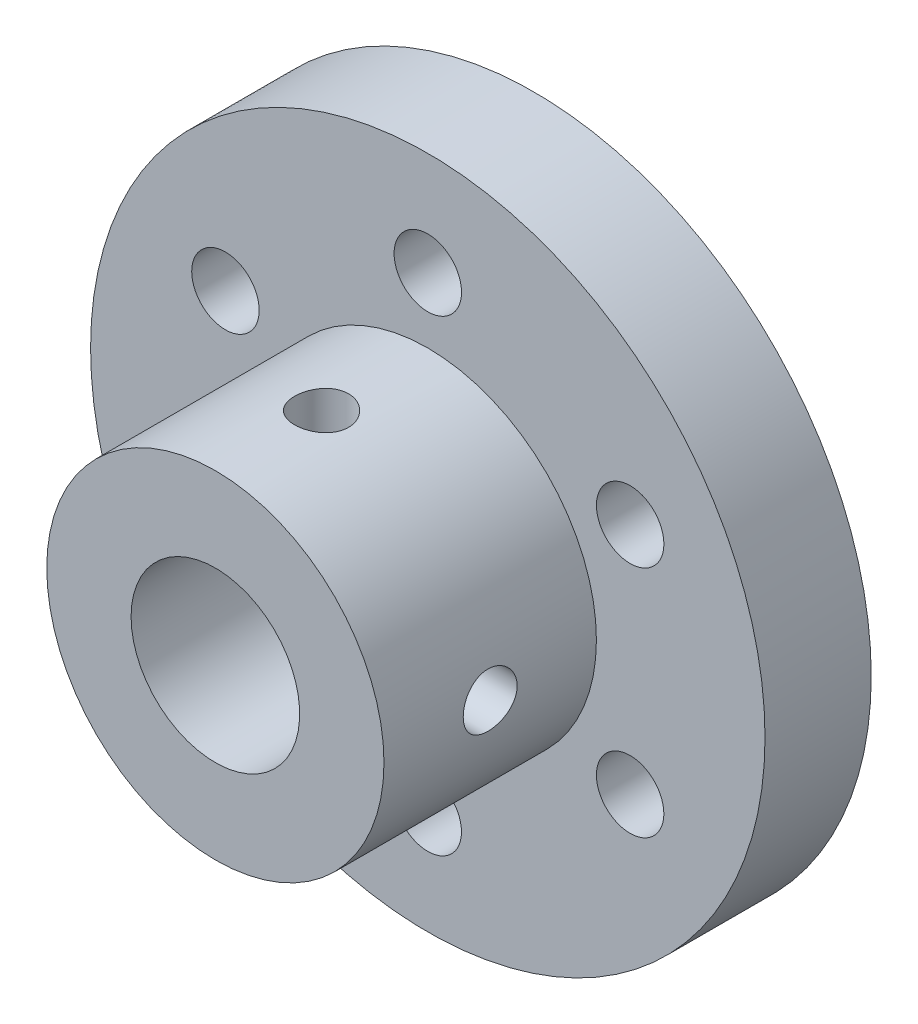
ISO-10303-21;
HEADER;
FILE_DESCRIPTION(('STEP AP214'),'2;1');
FILE_NAME('part.step','',(''),(''),'','','');
FILE_SCHEMA(('AUTOMOTIVE_DESIGN { 1 0 10303 214 1 1 1 1 }'));
ENDSEC;
DATA;
#1=APPLICATION_CONTEXT('core data for automotive mechanical design processes');
#2=APPLICATION_PROTOCOL_DEFINITION('international standard','automotive_design',2000,#1);
#3=PRODUCT_CONTEXT('',#1,'mechanical');
#4=PRODUCT('Part','Part','',(#3));
#5=PRODUCT_RELATED_PRODUCT_CATEGORY('part','',(#4));
#6=PRODUCT_DEFINITION_FORMATION('','',#4);
#7=PRODUCT_DEFINITION_CONTEXT('part definition',#1,'design');
#8=PRODUCT_DEFINITION('design','',#6,#7);
#9=PRODUCT_DEFINITION_SHAPE('','',#8);
#10=(LENGTH_UNIT() NAMED_UNIT(*) SI_UNIT(.MILLI.,.METRE.));
#11=(NAMED_UNIT(*) PLANE_ANGLE_UNIT() SI_UNIT($,.RADIAN.));
#12=(NAMED_UNIT(*) SI_UNIT($,.STERADIAN.) SOLID_ANGLE_UNIT());
#13=UNCERTAINTY_MEASURE_WITH_UNIT(LENGTH_MEASURE(1.E-05),#10,'distance_accuracy_value','');
#14=(GEOMETRIC_REPRESENTATION_CONTEXT(3) GLOBAL_UNCERTAINTY_ASSIGNED_CONTEXT((#13)) GLOBAL_UNIT_ASSIGNED_CONTEXT((#10,
#11,#12)) REPRESENTATION_CONTEXT('',''));
#15=CARTESIAN_POINT('',(0.,0.,0.));
#16=DIRECTION('',(0.,0.,1.));
#17=DIRECTION('',(1.,0.,0.));
#18=AXIS2_PLACEMENT_3D('',#15,#16,#17);
#19=CARTESIAN_POINT('',(0.,0.,5.));
#20=DIRECTION('',(0.,0.,1.));
#21=DIRECTION('',(1.,0.,0.));
#22=AXIS2_PLACEMENT_3D('',#19,#20,#21);
#23=CYLINDRICAL_SURFACE('',#22,7.9375);
#24=CARTESIAN_POINT('',(0.,7.9375,8.73));
#25=CARTESIAN_POINT('',(0.070851407781238,7.93749881522331,8.73000287568016));
#26=CARTESIAN_POINT('',(0.141742492651312,7.93654144694968,8.73594906563115));
#27=CARTESIAN_POINT('',(0.281539175082981,7.93281448370788,8.75956842428822));
#28=CARTESIAN_POINT('',(0.350442838695835,7.93004318186213,8.77725263847659));
#29=CARTESIAN_POINT('',(0.484221644665193,7.92299943464819,8.82380275908321));
#30=CARTESIAN_POINT('',(0.549099932369444,7.91872817914797,8.8526598042867));
#31=CARTESIAN_POINT('',(0.673084661159369,7.90915512273733,8.92071386444259));
#32=CARTESIAN_POINT('',(0.732191819172572,7.90385345007742,8.9599095928111));
#33=CARTESIAN_POINT('',(0.843487959989682,7.89275563243644,9.04789725870664));
#34=CARTESIAN_POINT('',(0.895618520243992,7.88695590781328,9.09676265163018));
#35=CARTESIAN_POINT('',(0.990977255302022,7.87554330342458,9.2025444367196));
#36=CARTESIAN_POINT('',(1.034204889236,7.86993043502826,9.25946131767461));
#37=CARTESIAN_POINT('',(1.11076210037391,7.85949236822154,9.38012816770656));
#38=CARTESIAN_POINT('',(1.14403441402271,7.85467179601296,9.44391490272462));
#39=CARTESIAN_POINT('',(1.19937041661255,7.84641347877964,9.57626174592169));
#40=CARTESIAN_POINT('',(1.22143480196936,7.84297564783966,9.6448215572198));
#41=CARTESIAN_POINT('',(1.25354561762643,7.83790751911401,9.78415103930916));
#42=CARTESIAN_POINT('',(1.26369257326004,7.8362621106573,9.85489698245327));
#43=CARTESIAN_POINT('',(1.27199206699361,7.83491935146036,9.99710502679925));
#44=CARTESIAN_POINT('',(1.27014538765812,7.83522187362091,10.0685670809723));
#45=CARTESIAN_POINT('',(1.25459202381916,7.83772698901834,10.2094642943668));
#46=CARTESIAN_POINT('',(1.24099786551273,7.83991155402772,10.2789122421243));
#47=CARTESIAN_POINT('',(1.20251184131289,7.84590641383103,10.4145286801472));
#48=CARTESIAN_POINT('',(1.17761961577252,7.8497167603776,10.4806970659413));
#49=CARTESIAN_POINT('',(1.11712875854476,7.85855350959892,10.6082152350885));
#50=CARTESIAN_POINT('',(1.08148301494118,7.86358524390989,10.6695422853002));
#51=CARTESIAN_POINT('',(1.0005304642155,7.87429405652976,10.7853872225202));
#52=CARTESIAN_POINT('',(0.955222937248658,7.87997118290846,10.8399046016982));
#53=CARTESIAN_POINT('',(0.855617948958114,7.89141050907362,10.9412343382777));
#54=CARTESIAN_POINT('',(0.801223858214554,7.89717294071722,10.9879517369887));
#55=CARTESIAN_POINT('',(0.685317637922132,7.90807363698763,11.0716099591653));
#56=CARTESIAN_POINT('',(0.623805468932401,7.91321189815563,11.1085507284555));
#57=CARTESIAN_POINT('',(0.495322789076292,7.92229178619144,11.1716141656024));
#58=CARTESIAN_POINT('',(0.428348309812673,7.92623253305736,11.1977288829657));
#59=CARTESIAN_POINT('',(0.290887044551755,7.93246620001937,11.238313092283));
#60=CARTESIAN_POINT('',(0.220400529524914,7.93475924703356,11.25278348118));
#61=CARTESIAN_POINT('',(0.0787349551802505,7.93742218998964,11.2695405584582));
#62=CARTESIAN_POINT('',(0.00757169787437782,7.93781267379405,11.2719576833831));
#63=CARTESIAN_POINT('',(-0.134143350909576,7.93668273918425,11.2648867376781));
#64=CARTESIAN_POINT('',(-0.204695163922473,7.93516238834649,11.2553990880593));
#65=CARTESIAN_POINT('',(-0.342784936879548,7.93039435096735,11.2248963956498));
#66=CARTESIAN_POINT('',(-0.410337428245323,7.92715628054623,11.2039455059316));
#67=CARTESIAN_POINT('',(-0.540971099022108,7.91931452803828,11.1511791374834));
#68=CARTESIAN_POINT('',(-0.604052043729408,7.91471077433478,11.1193630889693));
#69=CARTESIAN_POINT('',(-0.724521443466834,7.90459761164201,11.0454678104424));
#70=CARTESIAN_POINT('',(-0.781858991965773,7.89908108749526,11.0033065811253));
#71=CARTESIAN_POINT('',(-0.888691489311007,7.88777693087703,10.9100311019798));
#72=CARTESIAN_POINT('',(-0.938185915345797,7.88198928036594,10.8589162557936));
#73=CARTESIAN_POINT('',(-1.02840705246551,7.87072913234017,10.748601253554));
#74=CARTESIAN_POINT('',(-1.06904591508347,7.8652601549815,10.6893288354704));
#75=CARTESIAN_POINT('',(-1.13979000648426,7.85532090541608,10.5647221489886));
#76=CARTESIAN_POINT('',(-1.16989554961135,7.85085060340744,10.4993880615615));
#77=CARTESIAN_POINT('',(-1.21858505554888,7.84344088665036,10.3647649808964));
#78=CARTESIAN_POINT('',(-1.23721377463098,7.84049553232037,10.2954925163304));
#79=CARTESIAN_POINT('',(-1.26256236282082,7.83645392460158,10.1547510430551));
#80=CARTESIAN_POINT('',(-1.26928317865269,7.83535752421415,10.0832822094253));
#81=CARTESIAN_POINT('',(-1.2706003710268,7.83514395366915,9.94105327166775));
#82=CARTESIAN_POINT('',(-1.26533495866618,7.83600422141749,9.87029444309225));
#83=CARTESIAN_POINT('',(-1.24312691412839,7.83955777943964,9.73068296013171));
#84=CARTESIAN_POINT('',(-1.22618431151942,7.842251065072,9.66183030092045));
#85=CARTESIAN_POINT('',(-1.18115411377965,7.84915890072376,9.52803285273954));
#86=CARTESIAN_POINT('',(-1.15307749934035,7.85337195153704,9.46308428589776));
#87=CARTESIAN_POINT('',(-1.08659026575495,7.86284621023041,9.3387970630276));
#88=CARTESIAN_POINT('',(-1.04817920046562,7.86810746335936,9.27945864934172));
#89=CARTESIAN_POINT('',(-0.961616463857948,7.87915726728903,9.16737620116879));
#90=CARTESIAN_POINT('',(-0.913362820089091,7.88495095738304,9.11471141758324));
#91=CARTESIAN_POINT('',(-0.808700023173001,7.89637105825344,9.01817863281257));
#92=CARTESIAN_POINT('',(-0.75228898565273,7.90199743001593,8.97431266977557));
#93=CARTESIAN_POINT('',(-0.632490700076607,7.91248992574511,8.8963716089809));
#94=CARTESIAN_POINT('',(-0.569061631619728,7.91735102234628,8.8623601150815));
#95=CARTESIAN_POINT('',(-0.437340481025096,7.92571622565472,8.80552607900908));
#96=CARTESIAN_POINT('',(-0.369053402868193,7.92922170542079,8.78269220912897));
#97=CARTESIAN_POINT('',(-0.250403054462154,7.93370114994207,8.75391045590297));
#98=CARTESIAN_POINT('',(-0.200763808211668,7.93511822792316,8.74495812172657));
#99=CARTESIAN_POINT('',(-0.100756389896331,7.93701806717634,8.73300191623161));
#100=CARTESIAN_POINT('',(-0.0503882288771549,7.93750084259157,8.72999795486872));
#101=CARTESIAN_POINT('',(0.,7.9375,8.73));
#102=B_SPLINE_CURVE_WITH_KNOTS('',3,(#24,#25,#26,#27,#28,#29,#30,#31,#32,#33,#34,#35,#36,#37,
#38,#39,#40,#41,#42,#43,#44,#45,#46,#47,#48,#49,#50,#51,#52,#53,#54,#55,#56,#57,#58,#59,#60,#61,
#62,#63,#64,#65,#66,#67,#68,#69,#70,#71,#72,#73,#74,#75,#76,#77,#78,#79,#80,#81,#82,#83,#84,#85,
#86,#87,#88,#89,#90,#91,#92,#93,#94,#95,#96,#97,#98,#99,#100,#101),.UNSPECIFIED.,.T.,.F.,(4,2,2,
2,2,2,2,2,2,2,2,2,2,2,2,2,2,2,2,2,2,2,2,2,2,2,2,2,2,2,2,2,2,2,2,2,2,2,4),(0.,0.21237006460557,
0.424940253317862,0.637342196012102,0.84971771908481,1.06377317476229,1.27784163088313,
1.49311874112475,1.70838247327227,1.92181707628228,2.13523775318262,2.34663650490467,
2.55804198647242,2.77038744288382,2.98274872548303,3.19753178969243,3.41231604405963,
3.62725775458872,3.84218290693323,4.05477708315323,4.26736374121515,4.47877266694175,
4.69019268095133,4.90334591645242,5.11651335447677,5.33170782199994,5.54689586695901,
5.761239339578,5.97556577030142,6.187433375973,6.39930044516944,6.61095908239093,
6.82262685848445,7.03661045592319,7.25064356316656,7.466028810929,7.68119532721233,
7.83223132985441,7.98326504615038),.UNSPECIFIED.);
#103=CARTESIAN_POINT('',(0.,7.9375,8.73));
#104=VERTEX_POINT('',#103);
#105=EDGE_CURVE('E94',#104,#104,#102,.T.);
#106=ORIENTED_EDGE('',*,*,#105,.T.);
#107=EDGE_LOOP('',(#106));
#108=FACE_BOUND('',#107,.T.);
#109=CARTESIAN_POINT('',(0.,0.,5.));
#110=DIRECTION('',(0.,0.,1.));
#111=DIRECTION('',(1.,0.,0.));
#112=AXIS2_PLACEMENT_3D('',#109,#110,#111);
#113=CIRCLE('',#112,7.9375);
#114=CARTESIAN_POINT('',(7.9375,0.,5.));
#115=VERTEX_POINT('',#114);
#116=EDGE_CURVE('E165',#115,#115,#113,.T.);
#117=ORIENTED_EDGE('',*,*,#116,.T.);
#118=EDGE_LOOP('',(#117));
#119=FACE_BOUND('',#118,.T.);
#120=CARTESIAN_POINT('',(0.,0.,15.));
#121=DIRECTION('',(0.,0.,1.));
#122=DIRECTION('',(1.,0.,0.));
#123=AXIS2_PLACEMENT_3D('',#120,#121,#122);
#124=CIRCLE('',#123,7.9375);
#125=CARTESIAN_POINT('',(7.9375,0.,15.));
#126=VERTEX_POINT('',#125);
#127=EDGE_CURVE('E167',#126,#126,#124,.T.);
#128=ORIENTED_EDGE('',*,*,#127,.F.);
#129=EDGE_LOOP('',(#128));
#130=FACE_BOUND('',#129,.T.);
#131=CARTESIAN_POINT('',(7.9375,0.,8.73));
#132=CARTESIAN_POINT('',(7.93749881522331,-0.070851407781238,8.73000287568016));
#133=CARTESIAN_POINT('',(7.93654144694968,-0.141742492651312,8.73594906563115));
#134=CARTESIAN_POINT('',(7.93281448370788,-0.281539175082982,8.75956842428822));
#135=CARTESIAN_POINT('',(7.93004318186213,-0.350442838695835,8.77725263847659));
#136=CARTESIAN_POINT('',(7.92299943464819,-0.484221644665194,8.82380275908321));
#137=CARTESIAN_POINT('',(7.91872817914797,-0.549099932369445,8.8526598042867));
#138=CARTESIAN_POINT('',(7.90915512273733,-0.67308466115937,8.92071386444259));
#139=CARTESIAN_POINT('',(7.90385345007742,-0.732191819172572,8.95990959281111));
#140=CARTESIAN_POINT('',(7.89275563243644,-0.843487959989681,9.04789725870664));
#141=CARTESIAN_POINT('',(7.88695590781328,-0.895618520243991,9.09676265163018));
#142=CARTESIAN_POINT('',(7.87554330342458,-0.990977255302022,9.2025444367196));
#143=CARTESIAN_POINT('',(7.86993043502826,-1.034204889236,9.2594613176746));
#144=CARTESIAN_POINT('',(7.85949236822154,-1.11076210037391,9.38012816770656));
#145=CARTESIAN_POINT('',(7.85467179601296,-1.14403441402271,9.44391490272461));
#146=CARTESIAN_POINT('',(7.84641347877964,-1.19937041661255,9.57626174592169));
#147=CARTESIAN_POINT('',(7.84297564783966,-1.22143480196936,9.64482155721979));
#148=CARTESIAN_POINT('',(7.83790751911401,-1.25354561762643,9.78415103930916));
#149=CARTESIAN_POINT('',(7.8362621106573,-1.26369257326004,9.85489698245327));
#150=CARTESIAN_POINT('',(7.83491935146036,-1.27199206699361,9.99710502679925));
#151=CARTESIAN_POINT('',(7.83522187362091,-1.27014538765812,10.0685670809723));
#152=CARTESIAN_POINT('',(7.83772698901834,-1.25459202381916,10.2094642943668));
#153=CARTESIAN_POINT('',(7.83991155402772,-1.24099786551273,10.2789122421243));
#154=CARTESIAN_POINT('',(7.84590641383103,-1.20251184131289,10.4145286801472));
#155=CARTESIAN_POINT('',(7.8497167603776,-1.17761961577252,10.4806970659413));
#156=CARTESIAN_POINT('',(7.85855350959892,-1.11712875854476,10.6082152350885));
#157=CARTESIAN_POINT('',(7.86358524390989,-1.08148301494119,10.6695422853002));
#158=CARTESIAN_POINT('',(7.87429405652976,-1.0005304642155,10.7853872225202));
#159=CARTESIAN_POINT('',(7.87997118290846,-0.955222937248659,10.8399046016982));
#160=CARTESIAN_POINT('',(7.89141050907362,-0.855617948958115,10.9412343382777));
#161=CARTESIAN_POINT('',(7.89717294071722,-0.801223858214555,10.9879517369887));
#162=CARTESIAN_POINT('',(7.90807363698763,-0.685317637922132,11.0716099591653));
#163=CARTESIAN_POINT('',(7.91321189815563,-0.623805468932401,11.1085507284555));
#164=CARTESIAN_POINT('',(7.92229178619144,-0.495322789076291,11.1716141656024));
#165=CARTESIAN_POINT('',(7.92623253305736,-0.428348309812672,11.1977288829657));
#166=CARTESIAN_POINT('',(7.93246620001937,-0.290887044551754,11.238313092283));
#167=CARTESIAN_POINT('',(7.93475924703356,-0.220400529524914,11.25278348118));
#168=CARTESIAN_POINT('',(7.93742218998964,-0.078734955180251,11.2695405584582));
#169=CARTESIAN_POINT('',(7.93781267379405,-0.00757169787437832,11.2719576833831));
#170=CARTESIAN_POINT('',(7.93668273918425,0.134143350909576,11.2648867376781));
#171=CARTESIAN_POINT('',(7.93516238834649,0.204695163922473,11.2553990880593));
#172=CARTESIAN_POINT('',(7.93039435096735,0.342784936879548,11.2248963956498));
#173=CARTESIAN_POINT('',(7.92715628054623,0.410337428245323,11.2039455059316));
#174=CARTESIAN_POINT('',(7.91931452803828,0.540971099022107,11.1511791374834));
#175=CARTESIAN_POINT('',(7.91471077433478,0.604052043729408,11.1193630889693));
#176=CARTESIAN_POINT('',(7.90459761164201,0.724521443466833,11.0454678104424));
#177=CARTESIAN_POINT('',(7.89908108749526,0.781858991965772,11.0033065811254));
#178=CARTESIAN_POINT('',(7.88777693087703,0.888691489311006,10.9100311019798));
#179=CARTESIAN_POINT('',(7.88198928036594,0.938185915345797,10.8589162557936));
#180=CARTESIAN_POINT('',(7.87072913234017,1.02840705246551,10.748601253554));
#181=CARTESIAN_POINT('',(7.8652601549815,1.06904591508347,10.6893288354704));
#182=CARTESIAN_POINT('',(7.85532090541608,1.13979000648426,10.5647221489886));
#183=CARTESIAN_POINT('',(7.85085060340744,1.16989554961136,10.4993880615615));
#184=CARTESIAN_POINT('',(7.84344088665036,1.21858505554888,10.3647649808964));
#185=CARTESIAN_POINT('',(7.84049553232037,1.23721377463098,10.2954925163304));
#186=CARTESIAN_POINT('',(7.83645392460158,1.26256236282082,10.1547510430551));
#187=CARTESIAN_POINT('',(7.83535752421415,1.26928317865269,10.0832822094253));
#188=CARTESIAN_POINT('',(7.83514395366915,1.2706003710268,9.94105327166775));
#189=CARTESIAN_POINT('',(7.83600422141749,1.26533495866619,9.87029444309225));
#190=CARTESIAN_POINT('',(7.83955777943964,1.24312691412839,9.73068296013171));
#191=CARTESIAN_POINT('',(7.842251065072,1.22618431151943,9.66183030092045));
#192=CARTESIAN_POINT('',(7.84915890072376,1.18115411377965,9.52803285273954));
#193=CARTESIAN_POINT('',(7.85337195153704,1.15307749934035,9.46308428589776));
#194=CARTESIAN_POINT('',(7.86284621023041,1.08659026575495,9.3387970630276));
#195=CARTESIAN_POINT('',(7.86810746335936,1.04817920046562,9.27945864934172));
#196=CARTESIAN_POINT('',(7.87915726728903,0.961616463857948,9.16737620116879));
#197=CARTESIAN_POINT('',(7.88495095738304,0.91336282008909,9.11471141758323));
#198=CARTESIAN_POINT('',(7.89637105825344,0.808700023172999,9.01817863281257));
#199=CARTESIAN_POINT('',(7.90199743001593,0.752288985652729,8.97431266977557));
#200=CARTESIAN_POINT('',(7.91248992574511,0.632490700076607,8.8963716089809));
#201=CARTESIAN_POINT('',(7.91735102234628,0.569061631619728,8.8623601150815));
#202=CARTESIAN_POINT('',(7.92571622565472,0.437340481025097,8.80552607900908));
#203=CARTESIAN_POINT('',(7.92922170542079,0.369053402868194,8.78269220912897));
#204=CARTESIAN_POINT('',(7.93370114994207,0.250403054462155,8.75391045590297));
#205=CARTESIAN_POINT('',(7.93511822792316,0.20076380821167,8.74495812172657));
#206=CARTESIAN_POINT('',(7.93701806717634,0.100756389896332,8.73300191623161));
#207=CARTESIAN_POINT('',(7.93750084259157,0.0503882288771554,8.72999795486872));
#208=CARTESIAN_POINT('',(7.9375,0.,8.73));
#209=B_SPLINE_CURVE_WITH_KNOTS('',3,(#131,#132,#133,#134,#135,#136,#137,#138,#139,#140,#141,
#142,#143,#144,#145,#146,#147,#148,#149,#150,#151,#152,#153,#154,#155,#156,#157,#158,#159,#160,
#161,#162,#163,#164,#165,#166,#167,#168,#169,#170,#171,#172,#173,#174,#175,#176,#177,#178,#179,
#180,#181,#182,#183,#184,#185,#186,#187,#188,#189,#190,#191,#192,#193,#194,#195,#196,#197,#198,
#199,#200,#201,#202,#203,#204,#205,#206,#207,#208),.UNSPECIFIED.,.T.,.F.,(4,2,2,2,2,2,2,2,2,2,2,
2,2,2,2,2,2,2,2,2,2,2,2,2,2,2,2,2,2,2,2,2,2,2,2,2,2,2,4),(0.,0.21237006460557,0.424940253317862,
0.637342196012104,0.84971771908481,1.06377317476228,1.27784163088313,1.49311874112475,
1.70838247327227,1.92181707628228,2.13523775318262,2.34663650490468,2.55804198647242,
2.77038744288382,2.98274872548303,3.19753178969243,3.41231604405963,3.62725775458872,
3.84218290693324,4.05477708315323,4.26736374121516,4.47877266694176,4.69019268095133,
4.90334591645242,5.11651335447677,5.33170782199994,5.54689586695901,5.761239339578,
5.97556577030142,6.187433375973,6.39930044516945,6.61095908239094,6.82262685848446,
7.0366104559232,7.25064356316657,7.46602881092901,7.68119532721233,7.83223132985442,
7.98326504615039),.UNSPECIFIED.);
#210=CARTESIAN_POINT('',(7.9375,0.,8.73));
#211=VERTEX_POINT('',#210);
#212=EDGE_CURVE('E95',#211,#211,#209,.T.);
#213=ORIENTED_EDGE('',*,*,#212,.T.);
#214=EDGE_LOOP('',(#213));
#215=FACE_BOUND('',#214,.T.);
#216=ADVANCED_FACE('F44',(#108,#119,#130,#215),#23,.T.);
#217=CARTESIAN_POINT('',(0.,0.,15.));
#218=DIRECTION('',(0.,0.,-1.));
#219=DIRECTION('',(-1.,0.,0.));
#220=AXIS2_PLACEMENT_3D('',#217,#218,#219);
#221=CYLINDRICAL_SURFACE('',#220,3.96875);
#222=CARTESIAN_POINT('',(0.,3.96875,8.73));
#223=CARTESIAN_POINT('',(0.0694497962633089,3.96874982969003,8.73000019339765));
#224=CARTESIAN_POINT('',(0.138901993165629,3.96690996174107,8.73571547250291));
#225=CARTESIAN_POINT('',(0.275770102857252,3.95975095599205,8.75836213175135));
#226=CARTESIAN_POINT('',(0.343185641552881,3.95443118301887,8.77529555950547));
#227=CARTESIAN_POINT('',(0.473987197972055,3.94089242010606,8.81974528121184));
#228=CARTESIAN_POINT('',(0.537379444499023,3.93267804748371,8.84724472706917));
#229=CARTESIAN_POINT('',(0.658652768013106,3.9141947817903,8.91197260888176));
#230=CARTESIAN_POINT('',(0.716532894326051,3.90392553525931,8.94920271895145));
#231=CARTESIAN_POINT('',(0.827003963999766,3.88204922672474,9.03359676509382));
#232=CARTESIAN_POINT('',(0.879392523220582,3.87041197700503,9.08101775979427));
#233=CARTESIAN_POINT('',(0.975625300564995,3.84728295901812,9.183900434072));
#234=CARTESIAN_POINT('',(1.01946782861326,3.83579121994661,9.23936370032605));
#235=CARTESIAN_POINT('',(1.09848169839854,3.8139275607173,9.35853320326762));
#236=CARTESIAN_POINT('',(1.13339660218518,3.80359273598112,9.42241692325849));
#237=CARTESIAN_POINT('',(1.19190227975581,3.78566884627675,9.55553361036752));
#238=CARTESIAN_POINT('',(1.21549620195078,3.77807901805863,9.62476508402822));
#239=CARTESIAN_POINT('',(1.24994300359611,3.76682097441224,9.76432181952284));
#240=CARTESIAN_POINT('',(1.26117268121818,3.76303710602866,9.83454448076567));
#241=CARTESIAN_POINT('',(1.27174968740463,3.75947647141969,9.97597128185266));
#242=CARTESIAN_POINT('',(1.2711003525564,3.75969857999174,10.0471751404825));
#243=CARTESIAN_POINT('',(1.25823170959502,3.76402297660685,10.185392683005));
#244=CARTESIAN_POINT('',(1.2464958094285,3.76796313835396,10.2524573099217));
#245=CARTESIAN_POINT('',(1.21257265560723,3.77901563097891,10.38361052026));
#246=CARTESIAN_POINT('',(1.19038424188779,3.78612831395207,10.4476987724832));
#247=CARTESIAN_POINT('',(1.13585343344807,3.80284556742389,10.5722126754429));
#248=CARTESIAN_POINT('',(1.1033622927608,3.81248625891306,10.6325681245865));
#249=CARTESIAN_POINT('',(1.02925161127666,3.83315721858552,10.7471267466525));
#250=CARTESIAN_POINT('',(0.987629603565542,3.84418786195291,10.8013282509277));
#251=CARTESIAN_POINT('',(0.89408437785182,3.8670418288761,10.9047675840876));
#252=CARTESIAN_POINT('',(0.841763431479632,3.87887782141493,10.9536436166952));
#253=CARTESIAN_POINT('',(0.729520886822363,3.90154452191184,11.042018075848));
#254=CARTESIAN_POINT('',(0.669598670049328,3.91237514794255,11.0815157385572));
#255=CARTESIAN_POINT('',(0.543132629690448,3.93193420609764,11.1502734831037));
#256=CARTESIAN_POINT('',(0.476536765556005,3.94064395184929,11.1794435237889));
#257=CARTESIAN_POINT('',(0.339039081224148,3.95484477873281,11.226057679851));
#258=CARTESIAN_POINT('',(0.268138642610666,3.9603368866243,11.2435055360795));
#259=CARTESIAN_POINT('',(0.127112545486521,3.96731667989813,11.2655550529155));
#260=CARTESIAN_POINT('',(0.0570708520260516,3.9689568526641,11.2706461709288));
#261=CARTESIAN_POINT('',(-0.0828756514855597,3.96850120159015,11.2692227455368));
#262=CARTESIAN_POINT('',(-0.152780480956906,3.96640595309588,11.2627099894103));
#263=CARTESIAN_POINT('',(-0.288555920699276,3.95881526877014,11.2386547227418));
#264=CARTESIAN_POINT('',(-0.354484275216931,3.95341067527857,11.2214066963693));
#265=CARTESIAN_POINT('',(-0.482490188339213,3.93983833883805,11.1767329467292));
#266=CARTESIAN_POINT('',(-0.544567263824087,3.9316702500513,11.149305949572));
#267=CARTESIAN_POINT('',(-0.664842558322167,3.91315202747059,11.0842855051148));
#268=CARTESIAN_POINT('',(-0.722904336272645,3.90275227726922,11.0464541936458));
#269=CARTESIAN_POINT('',(-0.832017880511502,3.88095655290843,10.9619822383176));
#270=CARTESIAN_POINT('',(-0.883067651845968,3.86956029674071,10.9153390963737));
#271=CARTESIAN_POINT('',(-0.978918551816049,3.84645667781216,10.8122648858088));
#272=CARTESIAN_POINT('',(-1.02337059958776,3.83475614307903,10.7555069125224));
#273=CARTESIAN_POINT('',(-1.10215475206599,3.8128610171812,10.6350836021487));
#274=CARTESIAN_POINT('',(-1.13648694014092,3.80266641361083,10.5714183219705));
#275=CARTESIAN_POINT('',(-1.19386016864113,3.78504658668295,10.4390679094421));
#276=CARTESIAN_POINT('',(-1.21693833881574,3.7776122760865,10.3704001553531));
#277=CARTESIAN_POINT('',(-1.25111405420383,3.7664332984111,10.2298642772118));
#278=CARTESIAN_POINT('',(-1.26221644786317,3.76268713822186,10.1579974605938));
#279=CARTESIAN_POINT('',(-1.27176637403634,3.75946930297147,10.0167671994894));
#280=CARTESIAN_POINT('',(-1.27078889579551,3.7598034025407,9.94744659729155));
#281=CARTESIAN_POINT('',(-1.25760444400305,3.76423363880489,9.81001037696545));
#282=CARTESIAN_POINT('',(-1.24539804308506,3.76832958365959,9.74189469757114));
#283=CARTESIAN_POINT('',(-1.21049520105357,3.77968306094785,9.60988503109496));
#284=CARTESIAN_POINT('',(-1.18797092179467,3.78688859737178,9.54594071087553));
#285=CARTESIAN_POINT('',(-1.13320851815784,3.80363393135028,9.42268835268511));
#286=CARTESIAN_POINT('',(-1.10096835078499,3.81317421976223,9.36338129311424));
#287=CARTESIAN_POINT('',(-1.02615417949008,3.83399898652909,9.24846985633389));
#288=CARTESIAN_POINT('',(-0.983212635675612,3.84533869497531,9.1931148164546));
#289=CARTESIAN_POINT('',(-0.888852360856063,3.86823887298121,9.09021030175486));
#290=CARTESIAN_POINT('',(-0.837431317949169,3.8797994019846,9.04266296274864));
#291=CARTESIAN_POINT('',(-0.725417816924304,3.90232192133692,8.95506123554789));
#292=CARTESIAN_POINT('',(-0.664568260460116,3.91324903055016,8.91532558194181));
#293=CARTESIAN_POINT('',(-0.53670480187951,3.93282318985217,8.84669697569784));
#294=CARTESIAN_POINT('',(-0.469693040171476,3.94147102762849,8.81780027578912));
#295=CARTESIAN_POINT('',(-0.336282848868096,3.95500495719592,8.77345957475958));
#296=CARTESIAN_POINT('',(-0.270174058399319,3.96011321658024,8.75721097984965));
#297=CARTESIAN_POINT('',(-0.13604398835417,3.96698544248484,8.73548231781994));
#298=CARTESIAN_POINT('',(-0.0680231456887324,3.96875016681143,8.72999981057516));
#299=CARTESIAN_POINT('',(0.,3.96875,8.73));
#300=B_SPLINE_CURVE_WITH_KNOTS('',3,(#222,#223,#224,#225,#226,#227,#228,#229,#230,#231,#232,
#233,#234,#235,#236,#237,#238,#239,#240,#241,#242,#243,#244,#245,#246,#247,#248,#249,#250,#251,
#252,#253,#254,#255,#256,#257,#258,#259,#260,#261,#262,#263,#264,#265,#266,#267,#268,#269,#270,
#271,#272,#273,#274,#275,#276,#277,#278,#279,#280,#281,#282,#283,#284,#285,#286,#287,#288,#289,
#290,#291,#292,#293,#294,#295,#296,#297,#298,#299),.UNSPECIFIED.,.T.,.F.,(4,2,2,2,2,2,2,2,2,2,2,
2,2,2,2,2,2,2,2,2,2,2,2,2,2,2,2,2,2,2,2,2,2,2,2,2,2,2,4),(0.,0.208099255081524,
0.416236504289014,0.624043235426172,0.83188574228233,1.04576338782806,1.25968328730563,
1.47919145381135,1.69863853877114,1.91119513937108,2.12369203780415,2.3273312717271,
2.5309931117303,2.73774055523218,2.94454392526576,3.16124657316845,3.3779668647074,
3.59653261621517,3.81502858457664,4.0247173965688,4.2343739141783,4.43851836757807,
4.64268837810427,4.85198225574971,5.06133555584575,5.27941375735866,5.49749016227117,
5.71484212848364,5.93210606572982,6.13906994631988,6.34602327310056,6.54964259406728,
6.75330476071493,6.96526544356197,7.17728401248866,7.39668864135121,7.61601734701657,
7.81988800112053,8.02371244277128),.UNSPECIFIED.);
#301=CARTESIAN_POINT('',(0.,3.96875,8.73));
#302=VERTEX_POINT('',#301);
#303=EDGE_CURVE('E89',#302,#302,#300,.T.);
#304=ORIENTED_EDGE('',*,*,#303,.F.);
#305=EDGE_LOOP('',(#304));
#306=FACE_BOUND('',#305,.T.);
#307=CARTESIAN_POINT('',(0.,0.,15.));
#308=DIRECTION('',(0.,0.,-1.));
#309=DIRECTION('',(-1.,0.,0.));
#310=AXIS2_PLACEMENT_3D('',#307,#308,#309);
#311=CIRCLE('',#310,3.96875);
#312=CARTESIAN_POINT('',(-3.96875,0.,15.));
#313=VERTEX_POINT('',#312);
#314=EDGE_CURVE('E172',#313,#313,#311,.T.);
#315=ORIENTED_EDGE('',*,*,#314,.F.);
#316=EDGE_LOOP('',(#315));
#317=FACE_BOUND('',#316,.T.);
#318=CARTESIAN_POINT('',(0.,0.,-3.));
#319=DIRECTION('',(0.,0.,-1.));
#320=DIRECTION('',(-1.,0.,0.));
#321=AXIS2_PLACEMENT_3D('',#318,#319,#320);
#322=CIRCLE('',#321,3.96875);
#323=CARTESIAN_POINT('',(-3.96875,0.,-3.));
#324=VERTEX_POINT('',#323);
#325=EDGE_CURVE('E68',#324,#324,#322,.T.);
#326=ORIENTED_EDGE('',*,*,#325,.T.);
#327=EDGE_LOOP('',(#326));
#328=FACE_BOUND('',#327,.T.);
#329=CARTESIAN_POINT('',(3.96875,0.,11.27));
#330=CARTESIAN_POINT('',(3.96874982969003,0.069449796263309,11.2699998066023));
#331=CARTESIAN_POINT('',(3.96690996174107,0.13890199316563,11.2642845274971));
#332=CARTESIAN_POINT('',(3.95975095599205,0.275770102857252,11.2416378682486));
#333=CARTESIAN_POINT('',(3.95443118301887,0.343185641552881,11.2247044404945));
#334=CARTESIAN_POINT('',(3.94089242010606,0.473987197972055,11.1802547187882));
#335=CARTESIAN_POINT('',(3.93267804748371,0.537379444499023,11.1527552729308));
#336=CARTESIAN_POINT('',(3.9141947817903,0.658652768013107,11.0880273911182));
#337=CARTESIAN_POINT('',(3.90392553525931,0.716532894326051,11.0507972810485));
#338=CARTESIAN_POINT('',(3.88204922672474,0.827003963999766,10.9664032349062));
#339=CARTESIAN_POINT('',(3.87041197700503,0.879392523220582,10.9189822402057));
#340=CARTESIAN_POINT('',(3.84728295901812,0.975625300564996,10.816099565928));
#341=CARTESIAN_POINT('',(3.83579121994661,1.01946782861326,10.7606362996739));
#342=CARTESIAN_POINT('',(3.8139275607173,1.09848169839854,10.6414667967324));
#343=CARTESIAN_POINT('',(3.80359273598112,1.13339660218518,10.5775830767415));
#344=CARTESIAN_POINT('',(3.78566884627675,1.19190227975581,10.4444663896325));
#345=CARTESIAN_POINT('',(3.77807901805863,1.21549620195078,10.3752349159718));
#346=CARTESIAN_POINT('',(3.76682097441224,1.24994300359611,10.2356781804772));
#347=CARTESIAN_POINT('',(3.76303710602866,1.26117268121819,10.1654555192343));
#348=CARTESIAN_POINT('',(3.75947647141969,1.27174968740463,10.0240287181473));
#349=CARTESIAN_POINT('',(3.75969857999174,1.2711003525564,9.9528248595175));
#350=CARTESIAN_POINT('',(3.76402297660685,1.25823170959502,9.81460731699496));
#351=CARTESIAN_POINT('',(3.76796313835396,1.2464958094285,9.74754269007827));
#352=CARTESIAN_POINT('',(3.77901563097891,1.21257265560723,9.61638947973999));
#353=CARTESIAN_POINT('',(3.78612831395207,1.19038424188779,9.55230122751675));
#354=CARTESIAN_POINT('',(3.80284556742389,1.13585343344807,9.42778732455707));
#355=CARTESIAN_POINT('',(3.81248625891306,1.1033622927608,9.36743187541352));
#356=CARTESIAN_POINT('',(3.83315721858552,1.02925161127666,9.2528732533475));
#357=CARTESIAN_POINT('',(3.84418786195291,0.987629603565542,9.19867174907231));
#358=CARTESIAN_POINT('',(3.8670418288761,0.89408437785182,9.09523241591238));
#359=CARTESIAN_POINT('',(3.87887782141493,0.841763431479632,9.04635638330481));
#360=CARTESIAN_POINT('',(3.90154452191184,0.729520886822363,8.95798192415204));
#361=CARTESIAN_POINT('',(3.91237514794255,0.669598670049327,8.91848426144282));
#362=CARTESIAN_POINT('',(3.93193420609764,0.543132629690448,8.84972651689632));
#363=CARTESIAN_POINT('',(3.94064395184929,0.476536765556005,8.82055647621108));
#364=CARTESIAN_POINT('',(3.95484477873281,0.339039081224148,8.77394232014897));
#365=CARTESIAN_POINT('',(3.9603368866243,0.268138642610666,8.75649446392048));
#366=CARTESIAN_POINT('',(3.96731667989813,0.127112545486521,8.73444494708448));
#367=CARTESIAN_POINT('',(3.9689568526641,0.0570708520260523,8.72935382907118));
#368=CARTESIAN_POINT('',(3.96850120159015,-0.082875651485559,8.73077725446316));
#369=CARTESIAN_POINT('',(3.96640595309588,-0.152780480956905,8.73729001058972));
#370=CARTESIAN_POINT('',(3.95881526877014,-0.288555920699276,8.76134527725817));
#371=CARTESIAN_POINT('',(3.95341067527857,-0.354484275216932,8.77859330363068));
#372=CARTESIAN_POINT('',(3.93983833883805,-0.482490188339213,8.82326705327077));
#373=CARTESIAN_POINT('',(3.9316702500513,-0.544567263824087,8.85069405042798));
#374=CARTESIAN_POINT('',(3.91315202747059,-0.664842558322167,8.91571449488515));
#375=CARTESIAN_POINT('',(3.90275227726922,-0.722904336272645,8.9535458063542));
#376=CARTESIAN_POINT('',(3.88095655290843,-0.832017880511502,9.03801776168235));
#377=CARTESIAN_POINT('',(3.86956029674072,-0.883067651845968,9.0846609036263));
#378=CARTESIAN_POINT('',(3.84645667781216,-0.97891855181605,9.18773511419117));
#379=CARTESIAN_POINT('',(3.83475614307903,-1.02337059958777,9.24449308747764));
#380=CARTESIAN_POINT('',(3.8128610171812,-1.10215475206599,9.36491639785129));
#381=CARTESIAN_POINT('',(3.80266641361083,-1.13648694014093,9.42858167802948));
#382=CARTESIAN_POINT('',(3.78504658668295,-1.19386016864113,9.56093209055794));
#383=CARTESIAN_POINT('',(3.7776122760865,-1.21693833881574,9.62959984464685));
#384=CARTESIAN_POINT('',(3.7664332984111,-1.25111405420383,9.77013572278816));
#385=CARTESIAN_POINT('',(3.76268713822186,-1.26221644786317,9.84200253940623));
#386=CARTESIAN_POINT('',(3.75946930297147,-1.27176637403634,9.98323280051057));
#387=CARTESIAN_POINT('',(3.7598034025407,-1.27078889579551,10.0525534027084));
#388=CARTESIAN_POINT('',(3.76423363880489,-1.25760444400305,10.1899896230346));
#389=CARTESIAN_POINT('',(3.76832958365959,-1.24539804308506,10.2581053024289));
#390=CARTESIAN_POINT('',(3.77968306094785,-1.21049520105357,10.390114968905));
#391=CARTESIAN_POINT('',(3.78688859737178,-1.18797092179467,10.4540592891245));
#392=CARTESIAN_POINT('',(3.80363393135028,-1.13320851815784,10.5773116473149));
#393=CARTESIAN_POINT('',(3.81317421976223,-1.100968350785,10.6366187068858));
#394=CARTESIAN_POINT('',(3.83399898652909,-1.02615417949008,10.7515301436661));
#395=CARTESIAN_POINT('',(3.84533869497531,-0.983212635675612,10.8068851835454));
#396=CARTESIAN_POINT('',(3.86823887298121,-0.888852360856063,10.9097896982451));
#397=CARTESIAN_POINT('',(3.8797994019846,-0.837431317949169,10.9573370372514));
#398=CARTESIAN_POINT('',(3.90232192133692,-0.725417816924305,11.0449387644521));
#399=CARTESIAN_POINT('',(3.91324903055016,-0.664568260460117,11.0846744180582));
#400=CARTESIAN_POINT('',(3.93282318985217,-0.53670480187951,11.1533030243022));
#401=CARTESIAN_POINT('',(3.9414710276285,-0.469693040171476,11.1821997242109));
#402=CARTESIAN_POINT('',(3.95500495719592,-0.336282848868095,11.2265404252404));
#403=CARTESIAN_POINT('',(3.96011321658024,-0.270174058399318,11.2427890201503));
#404=CARTESIAN_POINT('',(3.96698544248484,-0.13604398835417,11.2645176821801));
#405=CARTESIAN_POINT('',(3.96875016681143,-0.0680231456887324,11.2700001894248));
#406=CARTESIAN_POINT('',(3.96875,0.,11.27));
#407=B_SPLINE_CURVE_WITH_KNOTS('',3,(#329,#330,#331,#332,#333,#334,#335,#336,#337,#338,#339,
#340,#341,#342,#343,#344,#345,#346,#347,#348,#349,#350,#351,#352,#353,#354,#355,#356,#357,#358,
#359,#360,#361,#362,#363,#364,#365,#366,#367,#368,#369,#370,#371,#372,#373,#374,#375,#376,#377,
#378,#379,#380,#381,#382,#383,#384,#385,#386,#387,#388,#389,#390,#391,#392,#393,#394,#395,#396,
#397,#398,#399,#400,#401,#402,#403,#404,#405,#406),.UNSPECIFIED.,.T.,.F.,(4,2,2,2,2,2,2,2,2,2,2,
2,2,2,2,2,2,2,2,2,2,2,2,2,2,2,2,2,2,2,2,2,2,2,2,2,2,2,4),(0.,0.208099255081525,
0.416236504289014,0.624043235426172,0.831885742282331,1.04576338782806,1.25968328730563,
1.47919145381135,1.69863853877114,1.91119513937108,2.12369203780415,2.3273312717271,
2.5309931117303,2.73774055523218,2.94454392526576,3.16124657316845,3.37796686470741,
3.59653261621517,3.81502858457664,4.0247173965688,4.2343739141783,4.43851836757808,
4.64268837810427,4.85198225574971,5.06133555584575,5.27941375735866,5.49749016227117,
5.71484212848365,5.93210606572982,6.13906994631988,6.34602327310056,6.54964259406729,
6.75330476071494,6.96526544356198,7.17728401248867,7.39668864135122,7.61601734701658,
7.81988800112054,8.02371244277129),.UNSPECIFIED.);
#408=CARTESIAN_POINT('',(3.96875,0.,11.27));
#409=VERTEX_POINT('',#408);
#410=EDGE_CURVE('E48',#409,#409,#407,.T.);
#411=ORIENTED_EDGE('',*,*,#410,.F.);
#412=EDGE_LOOP('',(#411));
#413=FACE_BOUND('',#412,.T.);
#414=ADVANCED_FACE('F96',(#306,#317,#328,#413),#221,.F.);
#415=CARTESIAN_POINT('',(0.,0.,0.));
#416=DIRECTION('',(0.,0.,1.));
#417=DIRECTION('',(1.,0.,0.));
#418=AXIS2_PLACEMENT_3D('',#415,#416,#417);
#419=PLANE('',#418);
#420=CARTESIAN_POINT('',(9.52577944162876,5.49913397459633,0.));
#421=DIRECTION('',(0.,0.,-1.));
#422=DIRECTION('',(-1.,0.,0.));
#423=AXIS2_PLACEMENT_3D('',#420,#421,#422);
#424=CIRCLE('',#423,1.5875);
#425=CARTESIAN_POINT('',(7.93827944162876,5.49913397459633,0.));
#426=VERTEX_POINT('',#425);
#427=EDGE_CURVE('E88',#426,#426,#424,.T.);
#428=ORIENTED_EDGE('',*,*,#427,.F.);
#429=EDGE_LOOP('',(#428));
#430=FACE_BOUND('',#429,.T.);
#431=CARTESIAN_POINT('',(9.52477944162887,-5.5008660254037,0.));
#432=DIRECTION('',(0.,0.,-1.));
#433=DIRECTION('',(-1.,0.,0.));
#434=AXIS2_PLACEMENT_3D('',#431,#432,#433);
#435=CIRCLE('',#434,1.5875);
#436=CARTESIAN_POINT('',(7.93727944162887,-5.5008660254037,0.));
#437=VERTEX_POINT('',#436);
#438=EDGE_CURVE('E85',#437,#437,#435,.T.);
#439=ORIENTED_EDGE('',*,*,#438,.F.);
#440=EDGE_LOOP('',(#439));
#441=FACE_BOUND('',#440,.T.);
#442=CARTESIAN_POINT('',(-0.00199999999992319,-11.,0.));
#443=DIRECTION('',(0.,0.,-1.));
#444=DIRECTION('',(-1.,0.,0.));
#445=AXIS2_PLACEMENT_3D('',#442,#443,#444);
#446=CIRCLE('',#445,1.5875);
#447=CARTESIAN_POINT('',(-1.58949999999992,-11.,0.));
#448=VERTEX_POINT('',#447);
#449=EDGE_CURVE('E81',#448,#448,#446,.T.);
#450=ORIENTED_EDGE('',*,*,#449,.F.);
#451=EDGE_LOOP('',(#450));
#452=FACE_BOUND('',#451,.T.);
#453=CARTESIAN_POINT('',(-9.5277794416288,-5.49913397459626,0.));
#454=DIRECTION('',(0.,0.,-1.));
#455=DIRECTION('',(-1.,0.,0.));
#456=AXIS2_PLACEMENT_3D('',#453,#454,#455);
#457=CIRCLE('',#456,1.5875);
#458=CARTESIAN_POINT('',(-11.1152794416288,-5.49913397459626,0.));
#459=VERTEX_POINT('',#458);
#460=EDGE_CURVE('E77',#459,#459,#457,.T.);
#461=ORIENTED_EDGE('',*,*,#460,.F.);
#462=EDGE_LOOP('',(#461));
#463=FACE_BOUND('',#462,.T.);
#464=CARTESIAN_POINT('',(-9.52677944162884,5.50086602540376,0.));
#465=DIRECTION('',(0.,0.,-1.));
#466=DIRECTION('',(-1.,0.,0.));
#467=AXIS2_PLACEMENT_3D('',#464,#465,#466);
#468=CIRCLE('',#467,1.5875);
#469=CARTESIAN_POINT('',(-11.1142794416288,5.50086602540376,0.));
#470=VERTEX_POINT('',#469);
#471=EDGE_CURVE('E73',#470,#470,#468,.T.);
#472=ORIENTED_EDGE('',*,*,#471,.F.);
#473=EDGE_LOOP('',(#472));
#474=FACE_BOUND('',#473,.T.);
#475=CARTESIAN_POINT('',(0.,11.,0.));
#476=DIRECTION('',(0.,0.,-1.));
#477=DIRECTION('',(-1.,0.,0.));
#478=AXIS2_PLACEMENT_3D('',#475,#476,#477);
#479=CIRCLE('',#478,1.5875);
#480=CARTESIAN_POINT('',(-1.5875,11.,0.));
#481=VERTEX_POINT('',#480);
#482=EDGE_CURVE('E69',#481,#481,#479,.T.);
#483=ORIENTED_EDGE('',*,*,#482,.F.);
#484=EDGE_LOOP('',(#483));
#485=FACE_BOUND('',#484,.T.);
#486=CARTESIAN_POINT('',(0.,0.,0.));
#487=DIRECTION('',(0.,0.,1.));
#488=DIRECTION('',(1.,0.,0.));
#489=AXIS2_PLACEMENT_3D('',#486,#487,#488);
#490=CIRCLE('',#489,15.875);
#491=CARTESIAN_POINT('',(15.875,0.,0.));
#492=VERTEX_POINT('',#491);
#493=EDGE_CURVE('E56',#492,#492,#490,.T.);
#494=ORIENTED_EDGE('',*,*,#493,.F.);
#495=EDGE_LOOP('',(#494));
#496=FACE_BOUND('',#495,.T.);
#497=CARTESIAN_POINT('',(0.,0.,0.));
#498=DIRECTION('',(0.,0.,1.));
#499=DIRECTION('',(1.,0.,0.));
#500=AXIS2_PLACEMENT_3D('',#497,#498,#499);
#501=CIRCLE('',#500,4.699);
#502=CARTESIAN_POINT('',(4.699,0.,0.));
#503=VERTEX_POINT('',#502);
#504=EDGE_CURVE('E12',#503,#503,#501,.F.);
#505=ORIENTED_EDGE('',*,*,#504,.F.);
#506=EDGE_LOOP('',(#505));
#507=FACE_BOUND('',#506,.T.);
#508=ADVANCED_FACE('F132',(#430,#441,#452,#463,#474,#485,#496,#507),#419,.F.);
#509=CARTESIAN_POINT('',(0.,0.,15.));
#510=DIRECTION('',(0.,0.,-1.));
#511=DIRECTION('',(-1.,0.,0.));
#512=AXIS2_PLACEMENT_3D('',#509,#510,#511);
#513=CYLINDRICAL_SURFACE('',#512,15.875);
#514=ORIENTED_EDGE('',*,*,#493,.T.);
#515=EDGE_LOOP('',(#514));
#516=FACE_BOUND('',#515,.T.);
#517=CARTESIAN_POINT('',(0.,0.,5.));
#518=DIRECTION('',(0.,0.,1.));
#519=DIRECTION('',(1.,0.,0.));
#520=AXIS2_PLACEMENT_3D('',#517,#518,#519);
#521=CIRCLE('',#520,15.875);
#522=CARTESIAN_POINT('',(15.875,0.,5.));
#523=VERTEX_POINT('',#522);
#524=EDGE_CURVE('E61',#523,#523,#521,.T.);
#525=ORIENTED_EDGE('',*,*,#524,.F.);
#526=EDGE_LOOP('',(#525));
#527=FACE_BOUND('',#526,.T.);
#528=ADVANCED_FACE('F46',(#516,#527),#513,.T.);
#529=CARTESIAN_POINT('',(0.,0.,5.));
#530=DIRECTION('',(0.,0.,1.));
#531=DIRECTION('',(1.,0.,0.));
#532=AXIS2_PLACEMENT_3D('',#529,#530,#531);
#533=PLANE('',#532);
#534=CARTESIAN_POINT('',(9.52577944162876,5.49913397459633,5.));
#535=DIRECTION('',(0.,0.,1.));
#536=DIRECTION('',(1.,0.,0.));
#537=AXIS2_PLACEMENT_3D('',#534,#535,#536);
#538=CIRCLE('',#537,1.5875);
#539=CARTESIAN_POINT('',(11.1132794416288,5.49913397459633,5.));
#540=VERTEX_POINT('',#539);
#541=EDGE_CURVE('E86',#540,#540,#538,.T.);
#542=ORIENTED_EDGE('',*,*,#541,.F.);
#543=EDGE_LOOP('',(#542));
#544=FACE_BOUND('',#543,.T.);
#545=CARTESIAN_POINT('',(9.52477944162887,-5.5008660254037,5.));
#546=DIRECTION('',(0.,0.,1.));
#547=DIRECTION('',(1.,0.,0.));
#548=AXIS2_PLACEMENT_3D('',#545,#546,#547);
#549=CIRCLE('',#548,1.5875);
#550=CARTESIAN_POINT('',(11.1122794416289,-5.5008660254037,5.));
#551=VERTEX_POINT('',#550);
#552=EDGE_CURVE('E82',#551,#551,#549,.T.);
#553=ORIENTED_EDGE('',*,*,#552,.F.);
#554=EDGE_LOOP('',(#553));
#555=FACE_BOUND('',#554,.T.);
#556=CARTESIAN_POINT('',(-0.00199999999992319,-11.,5.));
#557=DIRECTION('',(0.,0.,1.));
#558=DIRECTION('',(1.,0.,0.));
#559=AXIS2_PLACEMENT_3D('',#556,#557,#558);
#560=CIRCLE('',#559,1.5875);
#561=CARTESIAN_POINT('',(1.58550000000008,-11.,5.));
#562=VERTEX_POINT('',#561);
#563=EDGE_CURVE('E78',#562,#562,#560,.T.);
#564=ORIENTED_EDGE('',*,*,#563,.F.);
#565=EDGE_LOOP('',(#564));
#566=FACE_BOUND('',#565,.T.);
#567=CARTESIAN_POINT('',(-9.5277794416288,-5.49913397459626,5.));
#568=DIRECTION('',(0.,0.,1.));
#569=DIRECTION('',(1.,0.,0.));
#570=AXIS2_PLACEMENT_3D('',#567,#568,#569);
#571=CIRCLE('',#570,1.5875);
#572=CARTESIAN_POINT('',(-7.9402794416288,-5.49913397459626,5.));
#573=VERTEX_POINT('',#572);
#574=EDGE_CURVE('E74',#573,#573,#571,.T.);
#575=ORIENTED_EDGE('',*,*,#574,.F.);
#576=EDGE_LOOP('',(#575));
#577=FACE_BOUND('',#576,.T.);
#578=CARTESIAN_POINT('',(-9.52677944162884,5.50086602540376,5.));
#579=DIRECTION('',(0.,0.,1.));
#580=DIRECTION('',(1.,0.,0.));
#581=AXIS2_PLACEMENT_3D('',#578,#579,#580);
#582=CIRCLE('',#581,1.5875);
#583=CARTESIAN_POINT('',(-7.93927944162884,5.50086602540376,5.));
#584=VERTEX_POINT('',#583);
#585=EDGE_CURVE('E70',#584,#584,#582,.T.);
#586=ORIENTED_EDGE('',*,*,#585,.F.);
#587=EDGE_LOOP('',(#586));
#588=FACE_BOUND('',#587,.T.);
#589=CARTESIAN_POINT('',(0.,11.,5.));
#590=DIRECTION('',(0.,0.,1.));
#591=DIRECTION('',(1.,0.,0.));
#592=AXIS2_PLACEMENT_3D('',#589,#590,#591);
#593=CIRCLE('',#592,1.5875);
#594=CARTESIAN_POINT('',(1.5875,11.,5.));
#595=VERTEX_POINT('',#594);
#596=EDGE_CURVE('E65',#595,#595,#593,.T.);
#597=ORIENTED_EDGE('',*,*,#596,.F.);
#598=EDGE_LOOP('',(#597));
#599=FACE_BOUND('',#598,.T.);
#600=ORIENTED_EDGE('',*,*,#116,.F.);
#601=EDGE_LOOP('',(#600));
#602=FACE_BOUND('',#601,.T.);
#603=ORIENTED_EDGE('',*,*,#524,.T.);
#604=EDGE_LOOP('',(#603));
#605=FACE_BOUND('',#604,.T.);
#606=ADVANCED_FACE('F123',(#544,#555,#566,#577,#588,#599,#602,#605),#533,.T.);
#607=CARTESIAN_POINT('',(0.,0.,15.));
#608=DIRECTION('',(0.,0.,1.));
#609=DIRECTION('',(1.,0.,0.));
#610=AXIS2_PLACEMENT_3D('',#607,#608,#609);
#611=PLANE('',#610);
#612=ORIENTED_EDGE('',*,*,#314,.T.);
#613=EDGE_LOOP('',(#612));
#614=FACE_BOUND('',#613,.T.);
#615=ORIENTED_EDGE('',*,*,#127,.T.);
#616=EDGE_LOOP('',(#615));
#617=FACE_BOUND('',#616,.T.);
#618=ADVANCED_FACE('F127',(#614,#617),#611,.T.);
#619=CARTESIAN_POINT('',(0.,0.,-3.));
#620=DIRECTION('',(0.,0.,-1.));
#621=DIRECTION('',(-1.,0.,0.));
#622=AXIS2_PLACEMENT_3D('',#619,#620,#621);
#623=PLANE('',#622);
#624=CARTESIAN_POINT('',(0.,0.,-3.));
#625=DIRECTION('',(0.,0.,-1.));
#626=DIRECTION('',(-1.,0.,0.));
#627=AXIS2_PLACEMENT_3D('',#624,#625,#626);
#628=CIRCLE('',#627,4.699);
#629=CARTESIAN_POINT('',(-4.699,0.,-3.));
#630=VERTEX_POINT('',#629);
#631=EDGE_CURVE('E177',#630,#630,#628,.T.);
#632=ORIENTED_EDGE('',*,*,#631,.T.);
#633=EDGE_LOOP('',(#632));
#634=FACE_BOUND('',#633,.T.);
#635=ORIENTED_EDGE('',*,*,#325,.F.);
#636=EDGE_LOOP('',(#635));
#637=FACE_BOUND('',#636,.T.);
#638=ADVANCED_FACE('F130',(#634,#637),#623,.T.);
#639=CARTESIAN_POINT('',(0.,0.,-3.));
#640=DIRECTION('',(0.,0.,1.));
#641=DIRECTION('',(1.,0.,0.));
#642=AXIS2_PLACEMENT_3D('',#639,#640,#641);
#643=CYLINDRICAL_SURFACE('',#642,4.699);
#644=ORIENTED_EDGE('',*,*,#631,.F.);
#645=EDGE_LOOP('',(#644));
#646=FACE_BOUND('',#645,.T.);
#647=ORIENTED_EDGE('',*,*,#504,.T.);
#648=EDGE_LOOP('',(#647));
#649=FACE_BOUND('',#648,.T.);
#650=ADVANCED_FACE('F209',(#646,#649),#643,.T.);
#651=CARTESIAN_POINT('',(0.,11.,15.));
#652=DIRECTION('',(0.,0.,-1.));
#653=DIRECTION('',(-1.,0.,0.));
#654=AXIS2_PLACEMENT_3D('',#651,#652,#653);
#655=CYLINDRICAL_SURFACE('',#654,1.5875);
#656=ORIENTED_EDGE('',*,*,#596,.T.);
#657=EDGE_LOOP('',(#656));
#658=FACE_BOUND('',#657,.T.);
#659=ORIENTED_EDGE('',*,*,#482,.T.);
#660=EDGE_LOOP('',(#659));
#661=FACE_BOUND('',#660,.T.);
#662=ADVANCED_FACE('F205',(#658,#661),#655,.F.);
#663=CARTESIAN_POINT('',(-9.52677944162884,5.50086602540376,15.));
#664=DIRECTION('',(0.,0.,-1.));
#665=DIRECTION('',(-1.,0.,0.));
#666=AXIS2_PLACEMENT_3D('',#663,#664,#665);
#667=CYLINDRICAL_SURFACE('',#666,1.5875);
#668=ORIENTED_EDGE('',*,*,#585,.T.);
#669=EDGE_LOOP('',(#668));
#670=FACE_BOUND('',#669,.T.);
#671=ORIENTED_EDGE('',*,*,#471,.T.);
#672=EDGE_LOOP('',(#671));
#673=FACE_BOUND('',#672,.T.);
#674=ADVANCED_FACE('F201',(#670,#673),#667,.F.);
#675=CARTESIAN_POINT('',(-9.5277794416288,-5.49913397459626,15.));
#676=DIRECTION('',(0.,0.,-1.));
#677=DIRECTION('',(-1.,0.,0.));
#678=AXIS2_PLACEMENT_3D('',#675,#676,#677);
#679=CYLINDRICAL_SURFACE('',#678,1.5875);
#680=ORIENTED_EDGE('',*,*,#574,.T.);
#681=EDGE_LOOP('',(#680));
#682=FACE_BOUND('',#681,.T.);
#683=ORIENTED_EDGE('',*,*,#460,.T.);
#684=EDGE_LOOP('',(#683));
#685=FACE_BOUND('',#684,.T.);
#686=ADVANCED_FACE('F195',(#682,#685),#679,.F.);
#687=CARTESIAN_POINT('',(-0.00199999999992319,-11.,15.));
#688=DIRECTION('',(0.,0.,-1.));
#689=DIRECTION('',(-1.,0.,0.));
#690=AXIS2_PLACEMENT_3D('',#687,#688,#689);
#691=CYLINDRICAL_SURFACE('',#690,1.5875);
#692=ORIENTED_EDGE('',*,*,#563,.T.);
#693=EDGE_LOOP('',(#692));
#694=FACE_BOUND('',#693,.T.);
#695=ORIENTED_EDGE('',*,*,#449,.T.);
#696=EDGE_LOOP('',(#695));
#697=FACE_BOUND('',#696,.T.);
#698=ADVANCED_FACE('F188',(#694,#697),#691,.F.);
#699=CARTESIAN_POINT('',(9.52477944162887,-5.5008660254037,15.));
#700=DIRECTION('',(0.,0.,-1.));
#701=DIRECTION('',(-1.,0.,0.));
#702=AXIS2_PLACEMENT_3D('',#699,#700,#701);
#703=CYLINDRICAL_SURFACE('',#702,1.5875);
#704=ORIENTED_EDGE('',*,*,#552,.T.);
#705=EDGE_LOOP('',(#704));
#706=FACE_BOUND('',#705,.T.);
#707=ORIENTED_EDGE('',*,*,#438,.T.);
#708=EDGE_LOOP('',(#707));
#709=FACE_BOUND('',#708,.T.);
#710=ADVANCED_FACE('F186',(#706,#709),#703,.F.);
#711=CARTESIAN_POINT('',(9.52577944162876,5.49913397459633,15.));
#712=DIRECTION('',(0.,0.,-1.));
#713=DIRECTION('',(-1.,0.,0.));
#714=AXIS2_PLACEMENT_3D('',#711,#712,#713);
#715=CYLINDRICAL_SURFACE('',#714,1.5875);
#716=ORIENTED_EDGE('',*,*,#541,.T.);
#717=EDGE_LOOP('',(#716));
#718=FACE_BOUND('',#717,.T.);
#719=ORIENTED_EDGE('',*,*,#427,.T.);
#720=EDGE_LOOP('',(#719));
#721=FACE_BOUND('',#720,.T.);
#722=ADVANCED_FACE('F105',(#718,#721),#715,.F.);
#723=CARTESIAN_POINT('',(0.,15.875,10.));
#724=DIRECTION('',(0.,-1.,0.));
#725=DIRECTION('',(0.,0.,-1.));
#726=AXIS2_PLACEMENT_3D('',#723,#724,#725);
#727=CYLINDRICAL_SURFACE('',#726,1.27);
#728=ORIENTED_EDGE('',*,*,#105,.F.);
#729=EDGE_LOOP('',(#728));
#730=FACE_BOUND('',#729,.T.);
#731=ORIENTED_EDGE('',*,*,#303,.T.);
#732=EDGE_LOOP('',(#731));
#733=FACE_BOUND('',#732,.T.);
#734=ADVANCED_FACE('F100',(#730,#733),#727,.F.);
#735=CARTESIAN_POINT('',(15.875,0.,10.));
#736=DIRECTION('',(-1.,0.,0.));
#737=DIRECTION('',(0.,0.,1.));
#738=AXIS2_PLACEMENT_3D('',#735,#736,#737);
#739=CYLINDRICAL_SURFACE('',#738,1.27);
#740=ORIENTED_EDGE('',*,*,#212,.F.);
#741=EDGE_LOOP('',(#740));
#742=FACE_BOUND('',#741,.T.);
#743=ORIENTED_EDGE('',*,*,#410,.T.);
#744=EDGE_LOOP('',(#743));
#745=FACE_BOUND('',#744,.T.);
#746=ADVANCED_FACE('F104',(#742,#745),#739,.F.);
#747=CLOSED_SHELL('',(#216,#414,#508,#528,#606,#618,#638,#650,#662,#674,#686,#698,#710,#722,
#734,#746));
#748=MANIFOLD_SOLID_BREP('B2',#747);
#749=ADVANCED_BREP_SHAPE_REPRESENTATION('',(#18,#748),#14);
#750=SHAPE_DEFINITION_REPRESENTATION(#9,#749);
ENDSEC;
END-ISO-10303-21;
